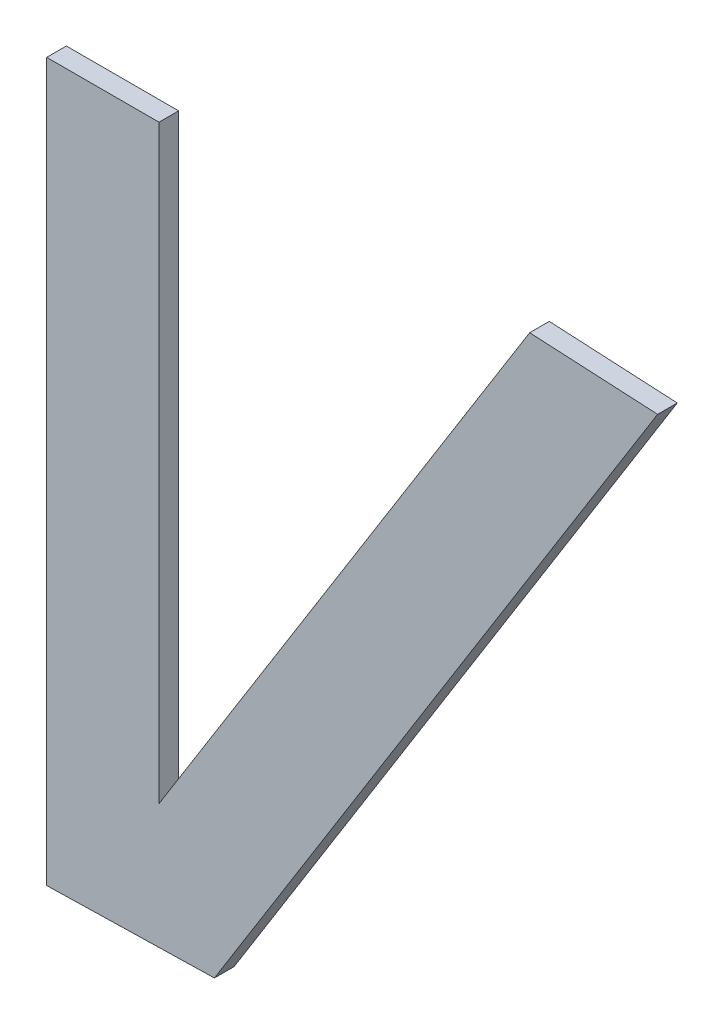
ISO-10303-21;
HEADER;
FILE_DESCRIPTION(('STEP AP214'),'2;1');
FILE_NAME('part.step','',(''),(''),'','','');
FILE_SCHEMA(('AUTOMOTIVE_DESIGN { 1 0 10303 214 1 1 1 1 }'));
ENDSEC;
DATA;
#1=APPLICATION_CONTEXT('core data for automotive mechanical design processes');
#2=APPLICATION_PROTOCOL_DEFINITION('international standard','automotive_design',2000,#1);
#3=PRODUCT_CONTEXT('',#1,'mechanical');
#4=PRODUCT('Part','Part','',(#3));
#5=PRODUCT_RELATED_PRODUCT_CATEGORY('part','',(#4));
#6=PRODUCT_DEFINITION_FORMATION('','',#4);
#7=PRODUCT_DEFINITION_CONTEXT('part definition',#1,'design');
#8=PRODUCT_DEFINITION('design','',#6,#7);
#9=PRODUCT_DEFINITION_SHAPE('','',#8);
#10=(LENGTH_UNIT() NAMED_UNIT(*) SI_UNIT(.MILLI.,.METRE.));
#11=(NAMED_UNIT(*) PLANE_ANGLE_UNIT() SI_UNIT($,.RADIAN.));
#12=(NAMED_UNIT(*) SI_UNIT($,.STERADIAN.) SOLID_ANGLE_UNIT());
#13=UNCERTAINTY_MEASURE_WITH_UNIT(LENGTH_MEASURE(1.E-05),#10,'distance_accuracy_value','');
#14=(GEOMETRIC_REPRESENTATION_CONTEXT(3) GLOBAL_UNCERTAINTY_ASSIGNED_CONTEXT((#13)) GLOBAL_UNIT_ASSIGNED_CONTEXT((#10,
#11,#12)) REPRESENTATION_CONTEXT('',''));
#15=CARTESIAN_POINT('',(0.,0.,0.));
#16=DIRECTION('',(0.,0.,1.));
#17=DIRECTION('',(1.,0.,0.));
#18=AXIS2_PLACEMENT_3D('',#15,#16,#17);
#19=CARTESIAN_POINT('',(0.,0.,0.));
#20=DIRECTION('',(0.,0.,1.));
#21=DIRECTION('',(1.,0.,0.));
#22=AXIS2_PLACEMENT_3D('',#19,#20,#21);
#23=PLANE('',#22);
#24=DIRECTION('',(0.,1.,0.));
#25=VECTOR('',#24,1.);
#26=CARTESIAN_POINT('',(-1.580896,-0.6872294791527,0.));
#27=LINE('',#26,#25);
#28=CARTESIAN_POINT('',(-1.58089599999998,-0.68722947915271,0.));
#29=VERTEX_POINT('',#28);
#30=CARTESIAN_POINT('',(-1.580896,0.814324,0.));
#31=VERTEX_POINT('',#30);
#32=EDGE_CURVE('E107',#29,#31,#27,.T.);
#33=ORIENTED_EDGE('',*,*,#32,.F.);
#34=DIRECTION('',(-0.529945833522928,-0.848031493242845,0.));
#35=VECTOR('',#34,1.);
#36=CARTESIAN_POINT('',(-0.637794,0.821944,0.));
#37=LINE('',#36,#35);
#38=CARTESIAN_POINT('',(-0.637794,0.821944,0.));
#39=VERTEX_POINT('',#38);
#40=EDGE_CURVE('E102',#39,#29,#37,.T.);
#41=ORIENTED_EDGE('',*,*,#40,.F.);
#42=DIRECTION('',(-0.998637128150149,0.0521908639516826,0.));
#43=VECTOR('',#42,1.);
#44=CARTESIAN_POINT('',(-0.312166,0.804926,0.));
#45=LINE('',#44,#43);
#46=CARTESIAN_POINT('',(-0.312165999999992,0.804925999999995,0.));
#47=VERTEX_POINT('',#46);
#48=EDGE_CURVE('E88',#47,#39,#45,.T.);
#49=ORIENTED_EDGE('',*,*,#48,.F.);
#50=DIRECTION('',(0.5296772029873,0.848199304783699,0.));
#51=VECTOR('',#50,1.);
#52=CARTESIAN_POINT('',(-1.439926,-1.001014,0.));
#53=LINE('',#52,#51);
#54=CARTESIAN_POINT('',(-1.439926,-1.001014,0.));
#55=VERTEX_POINT('',#54);
#56=EDGE_CURVE('E73',#55,#47,#53,.T.);
#57=ORIENTED_EDGE('',*,*,#56,.F.);
#58=DIRECTION('',(0.999744287459211,0.0226132636449103,0.));
#59=VECTOR('',#58,1.);
#60=CARTESIAN_POINT('',(-1.866646,-1.010666,0.));
#61=LINE('',#60,#59);
#62=CARTESIAN_POINT('',(-1.866646,-1.010666,0.));
#63=VERTEX_POINT('',#62);
#64=EDGE_CURVE('E20',#63,#55,#61,.T.);
#65=ORIENTED_EDGE('',*,*,#64,.F.);
#66=DIRECTION('',(0.,1.,0.));
#67=VECTOR('',#66,1.);
#68=CARTESIAN_POINT('',(-1.866646,0.814324,0.));
#69=LINE('',#68,#67);
#70=CARTESIAN_POINT('',(-1.866646,0.814324,0.));
#71=VERTEX_POINT('',#70);
#72=EDGE_CURVE('E116',#71,#63,#69,.F.);
#73=ORIENTED_EDGE('',*,*,#72,.F.);
#74=DIRECTION('',(1.,0.,0.));
#75=VECTOR('',#74,1.);
#76=CARTESIAN_POINT('',(-1.580896,0.814324,0.));
#77=LINE('',#76,#75);
#78=EDGE_CURVE('E112',#31,#71,#77,.F.);
#79=ORIENTED_EDGE('',*,*,#78,.F.);
#80=EDGE_LOOP('',(#33,#41,#49,#57,#65,#73,#79));
#81=FACE_BOUND('',#80,.T.);
#82=ADVANCED_FACE('F17',(#81),#23,.F.);
#83=CARTESIAN_POINT('',(-1.866646,-1.010666,0.));
#84=DIRECTION('',(0.0226132636449103,-0.999744287459211,0.));
#85=DIRECTION('',(0.999744287459211,0.0226132636449103,0.));
#86=AXIS2_PLACEMENT_3D('',#83,#84,#85);
#87=PLANE('',#86);
#88=DIRECTION('',(0.,0.,1.));
#89=VECTOR('',#88,1.);
#90=CARTESIAN_POINT('',(-1.866646,-1.010666,0.));
#91=LINE('',#90,#89);
#92=CARTESIAN_POINT('',(-1.866646,-1.010666,0.05));
#93=VERTEX_POINT('',#92);
#94=EDGE_CURVE('E82',#63,#93,#91,.T.);
#95=ORIENTED_EDGE('',*,*,#94,.F.);
#96=ORIENTED_EDGE('',*,*,#64,.T.);
#97=DIRECTION('',(0.,0.,1.));
#98=VECTOR('',#97,1.);
#99=CARTESIAN_POINT('',(-1.439926,-1.001014,0.));
#100=LINE('',#99,#98);
#101=CARTESIAN_POINT('',(-1.439926,-1.001014,0.05));
#102=VERTEX_POINT('',#101);
#103=EDGE_CURVE('E79',#102,#55,#100,.F.);
#104=ORIENTED_EDGE('',*,*,#103,.F.);
#105=DIRECTION('',(0.999744287459211,0.0226132636449107,0.));
#106=VECTOR('',#105,1.);
#107=CARTESIAN_POINT('',(-1.866646,-1.010666,0.05));
#108=LINE('',#107,#106);
#109=EDGE_CURVE('E118',#93,#102,#108,.T.);
#110=ORIENTED_EDGE('',*,*,#109,.F.);
#111=EDGE_LOOP('',(#95,#96,#104,#110));
#112=FACE_BOUND('',#111,.T.);
#113=ADVANCED_FACE('F78',(#112),#87,.T.);
#114=CARTESIAN_POINT('',(-1.439926,-1.001014,0.));
#115=DIRECTION('',(0.848199304783699,-0.5296772029873,0.));
#116=DIRECTION('',(0.5296772029873,0.848199304783699,0.));
#117=AXIS2_PLACEMENT_3D('',#114,#115,#116);
#118=PLANE('',#117);
#119=ORIENTED_EDGE('',*,*,#103,.T.);
#120=ORIENTED_EDGE('',*,*,#56,.T.);
#121=DIRECTION('',(0.,0.,1.));
#122=VECTOR('',#121,1.);
#123=CARTESIAN_POINT('',(-0.312166,0.804926,0.));
#124=LINE('',#123,#122);
#125=CARTESIAN_POINT('',(-0.312165999999992,0.804925999999995,0.05));
#126=VERTEX_POINT('',#125);
#127=EDGE_CURVE('E90',#126,#47,#124,.F.);
#128=ORIENTED_EDGE('',*,*,#127,.F.);
#129=DIRECTION('',(0.529677202987292,0.848199304783704,0.));
#130=VECTOR('',#129,1.);
#131=CARTESIAN_POINT('',(-1.439926,-1.001014,0.05));
#132=LINE('',#131,#130);
#133=EDGE_CURVE('E94',#102,#126,#132,.T.);
#134=ORIENTED_EDGE('',*,*,#133,.F.);
#135=EDGE_LOOP('',(#119,#120,#128,#134));
#136=FACE_BOUND('',#135,.T.);
#137=ADVANCED_FACE('F92',(#136),#118,.T.);
#138=CARTESIAN_POINT('',(-0.312166,0.804926,0.));
#139=DIRECTION('',(0.0521908639516826,0.998637128150149,0.));
#140=DIRECTION('',(-0.998637128150149,0.0521908639516826,0.));
#141=AXIS2_PLACEMENT_3D('',#138,#139,#140);
#142=PLANE('',#141);
#143=ORIENTED_EDGE('',*,*,#127,.T.);
#144=ORIENTED_EDGE('',*,*,#48,.T.);
#145=DIRECTION('',(0.,0.,1.));
#146=VECTOR('',#145,1.);
#147=CARTESIAN_POINT('',(-0.637794,0.821944,0.));
#148=LINE('',#147,#146);
#149=CARTESIAN_POINT('',(-0.637794,0.821944,0.05));
#150=VERTEX_POINT('',#149);
#151=EDGE_CURVE('E99',#150,#39,#148,.F.);
#152=ORIENTED_EDGE('',*,*,#151,.F.);
#153=DIRECTION('',(-0.998637128150149,0.0521908639516847,0.));
#154=VECTOR('',#153,1.);
#155=CARTESIAN_POINT('',(-0.312166,0.804926,0.05));
#156=LINE('',#155,#154);
#157=EDGE_CURVE('E121',#126,#150,#156,.T.);
#158=ORIENTED_EDGE('',*,*,#157,.F.);
#159=EDGE_LOOP('',(#143,#144,#152,#158));
#160=FACE_BOUND('',#159,.T.);
#161=ADVANCED_FACE('F155',(#160),#142,.T.);
#162=CARTESIAN_POINT('',(-0.637794,0.821944,0.));
#163=DIRECTION('',(-0.848031493242845,0.529945833522928,0.));
#164=DIRECTION('',(-0.529945833522928,-0.848031493242845,0.));
#165=AXIS2_PLACEMENT_3D('',#162,#163,#164);
#166=PLANE('',#165);
#167=ORIENTED_EDGE('',*,*,#151,.T.);
#168=ORIENTED_EDGE('',*,*,#40,.T.);
#169=DIRECTION('',(0.,0.,-1.));
#170=VECTOR('',#169,1.);
#171=CARTESIAN_POINT('',(-1.580896,-0.6872294791527,0.));
#172=LINE('',#171,#170);
#173=CARTESIAN_POINT('',(-1.58089599999998,-0.68722947915271,0.05));
#174=VERTEX_POINT('',#173);
#175=EDGE_CURVE('E104',#174,#29,#172,.T.);
#176=ORIENTED_EDGE('',*,*,#175,.F.);
#177=DIRECTION('',(-0.529945833522946,-0.848031493242833,0.));
#178=VECTOR('',#177,1.);
#179=CARTESIAN_POINT('',(-0.637794,0.821944,0.05));
#180=LINE('',#179,#178);
#181=EDGE_CURVE('E124',#150,#174,#180,.T.);
#182=ORIENTED_EDGE('',*,*,#181,.F.);
#183=EDGE_LOOP('',(#167,#168,#176,#182));
#184=FACE_BOUND('',#183,.T.);
#185=ADVANCED_FACE('F152',(#184),#166,.T.);
#186=CARTESIAN_POINT('',(-1.580896,-0.6872294791527,0.));
#187=DIRECTION('',(1.,0.,0.));
#188=DIRECTION('',(0.,0.,-1.));
#189=AXIS2_PLACEMENT_3D('',#186,#187,#188);
#190=PLANE('',#189);
#191=ORIENTED_EDGE('',*,*,#175,.T.);
#192=ORIENTED_EDGE('',*,*,#32,.T.);
#193=DIRECTION('',(0.,0.,1.));
#194=VECTOR('',#193,1.);
#195=CARTESIAN_POINT('',(-1.580896,0.814324,0.));
#196=LINE('',#195,#194);
#197=CARTESIAN_POINT('',(-1.580896,0.814324,0.05));
#198=VERTEX_POINT('',#197);
#199=EDGE_CURVE('E109',#198,#31,#196,.F.);
#200=ORIENTED_EDGE('',*,*,#199,.F.);
#201=DIRECTION('',(0.,1.,0.));
#202=VECTOR('',#201,1.);
#203=CARTESIAN_POINT('',(-1.580896,0.,0.05));
#204=LINE('',#203,#202);
#205=EDGE_CURVE('E127',#174,#198,#204,.T.);
#206=ORIENTED_EDGE('',*,*,#205,.F.);
#207=EDGE_LOOP('',(#191,#192,#200,#206));
#208=FACE_BOUND('',#207,.T.);
#209=ADVANCED_FACE('F137',(#208),#190,.T.);
#210=CARTESIAN_POINT('',(-1.580896,0.814324,0.));
#211=DIRECTION('',(0.,1.,0.));
#212=DIRECTION('',(0.,0.,1.));
#213=AXIS2_PLACEMENT_3D('',#210,#211,#212);
#214=PLANE('',#213);
#215=ORIENTED_EDGE('',*,*,#199,.T.);
#216=ORIENTED_EDGE('',*,*,#78,.T.);
#217=DIRECTION('',(0.,0.,1.));
#218=VECTOR('',#217,1.);
#219=CARTESIAN_POINT('',(-1.866646,0.814324,0.));
#220=LINE('',#219,#218);
#221=CARTESIAN_POINT('',(-1.866646,0.814324,0.05));
#222=VERTEX_POINT('',#221);
#223=EDGE_CURVE('E35',#222,#71,#220,.F.);
#224=ORIENTED_EDGE('',*,*,#223,.F.);
#225=DIRECTION('',(1.,0.,0.));
#226=VECTOR('',#225,1.);
#227=CARTESIAN_POINT('',(0.,0.814324,0.05));
#228=LINE('',#227,#226);
#229=EDGE_CURVE('E26',#198,#222,#228,.F.);
#230=ORIENTED_EDGE('',*,*,#229,.F.);
#231=EDGE_LOOP('',(#215,#216,#224,#230));
#232=FACE_BOUND('',#231,.T.);
#233=ADVANCED_FACE('F134',(#232),#214,.T.);
#234=CARTESIAN_POINT('',(-1.866646,0.814324,0.));
#235=DIRECTION('',(-1.,0.,0.));
#236=DIRECTION('',(0.,0.,1.));
#237=AXIS2_PLACEMENT_3D('',#234,#235,#236);
#238=PLANE('',#237);
#239=ORIENTED_EDGE('',*,*,#223,.T.);
#240=ORIENTED_EDGE('',*,*,#72,.T.);
#241=ORIENTED_EDGE('',*,*,#94,.T.);
#242=DIRECTION('',(0.,1.,0.));
#243=VECTOR('',#242,1.);
#244=CARTESIAN_POINT('',(-1.866646,0.,0.05));
#245=LINE('',#244,#243);
#246=EDGE_CURVE('E11',#222,#93,#245,.F.);
#247=ORIENTED_EDGE('',*,*,#246,.F.);
#248=EDGE_LOOP('',(#239,#240,#241,#247));
#249=FACE_BOUND('',#248,.T.);
#250=ADVANCED_FACE('F139',(#249),#238,.T.);
#251=CARTESIAN_POINT('',(0.,0.,0.05));
#252=DIRECTION('',(0.,0.,1.));
#253=DIRECTION('',(1.,0.,0.));
#254=AXIS2_PLACEMENT_3D('',#251,#252,#253);
#255=PLANE('',#254);
#256=ORIENTED_EDGE('',*,*,#229,.T.);
#257=ORIENTED_EDGE('',*,*,#246,.T.);
#258=ORIENTED_EDGE('',*,*,#109,.T.);
#259=ORIENTED_EDGE('',*,*,#133,.T.);
#260=ORIENTED_EDGE('',*,*,#157,.T.);
#261=ORIENTED_EDGE('',*,*,#181,.T.);
#262=ORIENTED_EDGE('',*,*,#205,.T.);
#263=EDGE_LOOP('',(#256,#257,#258,#259,#260,#261,#262));
#264=FACE_BOUND('',#263,.T.);
#265=ADVANCED_FACE('F132',(#264),#255,.T.);
#266=CLOSED_SHELL('',(#82,#113,#137,#161,#185,#209,#233,#250,#265));
#267=MANIFOLD_SOLID_BREP('B1',#266);
#268=ADVANCED_BREP_SHAPE_REPRESENTATION('',(#18,#267),#14);
#269=SHAPE_DEFINITION_REPRESENTATION(#9,#268);
ENDSEC;
END-ISO-10303-21;
